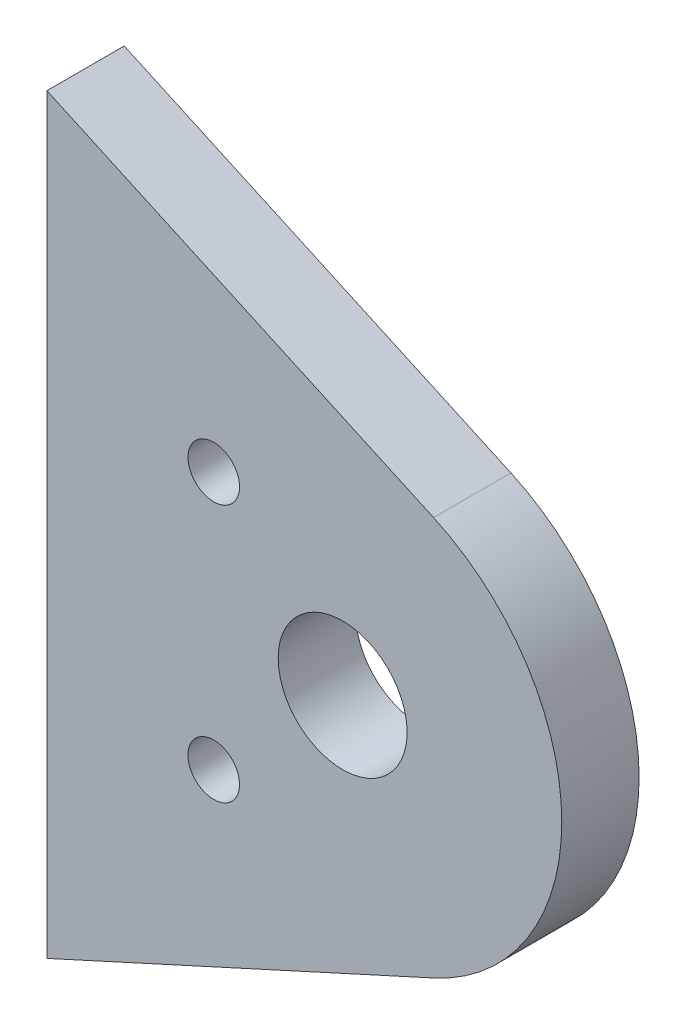
ISO-10303-21;
HEADER;
FILE_DESCRIPTION(('STEP AP214'),'2;1');
FILE_NAME('part.step','',(''),(''),'','','');
FILE_SCHEMA(('AUTOMOTIVE_DESIGN { 1 0 10303 214 1 1 1 1 }'));
ENDSEC;
DATA;
#1=APPLICATION_CONTEXT('core data for automotive mechanical design processes');
#2=APPLICATION_PROTOCOL_DEFINITION('international standard','automotive_design',2000,#1);
#3=PRODUCT_CONTEXT('',#1,'mechanical');
#4=PRODUCT('Part','Part','',(#3));
#5=PRODUCT_RELATED_PRODUCT_CATEGORY('part','',(#4));
#6=PRODUCT_DEFINITION_FORMATION('','',#4);
#7=PRODUCT_DEFINITION_CONTEXT('part definition',#1,'design');
#8=PRODUCT_DEFINITION('design','',#6,#7);
#9=PRODUCT_DEFINITION_SHAPE('','',#8);
#10=(LENGTH_UNIT() NAMED_UNIT(*) SI_UNIT(.MILLI.,.METRE.));
#11=(NAMED_UNIT(*) PLANE_ANGLE_UNIT() SI_UNIT($,.RADIAN.));
#12=(NAMED_UNIT(*) SI_UNIT($,.STERADIAN.) SOLID_ANGLE_UNIT());
#13=UNCERTAINTY_MEASURE_WITH_UNIT(LENGTH_MEASURE(1.E-05),#10,'distance_accuracy_value','');
#14=(GEOMETRIC_REPRESENTATION_CONTEXT(3) GLOBAL_UNCERTAINTY_ASSIGNED_CONTEXT((#13)) GLOBAL_UNIT_ASSIGNED_CONTEXT((#10,
#11,#12)) REPRESENTATION_CONTEXT('',''));
#15=CARTESIAN_POINT('',(0.,0.,0.));
#16=DIRECTION('',(0.,0.,1.));
#17=DIRECTION('',(1.,0.,0.));
#18=AXIS2_PLACEMENT_3D('',#15,#16,#17);
#19=CARTESIAN_POINT('',(50.,0.,42.));
#20=DIRECTION('',(0.,0.,-1.));
#21=DIRECTION('',(-1.,0.,0.));
#22=AXIS2_PLACEMENT_3D('',#19,#20,#21);
#23=CYLINDRICAL_SURFACE('',#22,8.5);
#24=DIRECTION('',(0.,0.,-1.));
#25=VECTOR('',#24,1.);
#26=CARTESIAN_POINT('',(53.5275,-7.73348199390158,42.));
#27=LINE('',#26,#25);
#28=CARTESIAN_POINT('',(53.5275,-7.73348199390158,9.));
#29=VERTEX_POINT('',#28);
#30=CARTESIAN_POINT('',(53.5275,-7.73348199390158,6.00000000000003));
#31=VERTEX_POINT('',#30);
#32=EDGE_CURVE('E91',#29,#31,#27,.T.);
#33=ORIENTED_EDGE('',*,*,#32,.T.);
#34=CARTESIAN_POINT('',(50.,0.,6.00000000000003));
#35=DIRECTION('',(0.,0.,1.));
#36=DIRECTION('',(1.,0.,0.));
#37=AXIS2_PLACEMENT_3D('',#34,#35,#36);
#38=CIRCLE('',#37,8.5);
#39=CARTESIAN_POINT('',(53.5275,7.73348199390159,6.00000000000003));
#40=VERTEX_POINT('',#39);
#41=EDGE_CURVE('E87',#31,#40,#38,.T.);
#42=ORIENTED_EDGE('',*,*,#41,.T.);
#43=DIRECTION('',(0.,0.,-1.));
#44=VECTOR('',#43,1.);
#45=CARTESIAN_POINT('',(53.5275,7.73348199390159,42.));
#46=LINE('',#45,#44);
#47=CARTESIAN_POINT('',(53.5275,7.73348199390159,9.));
#48=VERTEX_POINT('',#47);
#49=EDGE_CURVE('E40',#48,#40,#46,.T.);
#50=ORIENTED_EDGE('',*,*,#49,.F.);
#51=CARTESIAN_POINT('',(50.,0.,9.));
#52=DIRECTION('',(0.,0.,-1.));
#53=DIRECTION('',(-1.,0.,0.));
#54=AXIS2_PLACEMENT_3D('',#51,#52,#53);
#55=CIRCLE('',#54,8.5);
#56=EDGE_CURVE('E99',#48,#29,#55,.T.);
#57=ORIENTED_EDGE('',*,*,#56,.T.);
#58=EDGE_LOOP('',(#33,#42,#50,#57));
#59=FACE_BOUND('',#58,.T.);
#60=ADVANCED_FACE('F32',(#59),#23,.T.);
#61=CARTESIAN_POINT('',(12.13875,26.6122762731319,42.));
#62=DIRECTION('',(-0.415,-0.909821411047245,0.));
#63=DIRECTION('',(0.909821411047245,-0.415,0.));
#64=AXIS2_PLACEMENT_3D('',#61,#62,#63);
#65=PLANE('',#64);
#66=ORIENTED_EDGE('',*,*,#49,.T.);
#67=DIRECTION('',(-0.909821411047245,0.415,0.));
#68=VECTOR('',#67,1.);
#69=CARTESIAN_POINT('',(12.13875,26.6122762731319,6.00000000000003));
#70=LINE('',#69,#68);
#71=CARTESIAN_POINT('',(38.5275,14.5754840883948,6.00000000000003));
#72=VERTEX_POINT('',#71);
#73=EDGE_CURVE('E73',#40,#72,#70,.T.);
#74=ORIENTED_EDGE('',*,*,#73,.T.);
#75=DIRECTION('',(0.,0.,1.));
#76=VECTOR('',#75,1.);
#77=CARTESIAN_POINT('',(38.5275,14.5754840883948,42.));
#78=LINE('',#77,#76);
#79=CARTESIAN_POINT('',(38.5275,14.5754840883948,9.));
#80=VERTEX_POINT('',#79);
#81=EDGE_CURVE('E78',#72,#80,#78,.T.);
#82=ORIENTED_EDGE('',*,*,#81,.T.);
#83=DIRECTION('',(0.909821411047245,-0.415,0.));
#84=VECTOR('',#83,1.);
#85=CARTESIAN_POINT('',(12.13875,26.6122762731319,9.));
#86=LINE('',#85,#84);
#87=EDGE_CURVE('E47',#80,#48,#86,.T.);
#88=ORIENTED_EDGE('',*,*,#87,.T.);
#89=EDGE_LOOP('',(#66,#74,#82,#88));
#90=FACE_BOUND('',#89,.T.);
#91=ADVANCED_FACE('F84',(#90),#65,.F.);
#92=CARTESIAN_POINT('',(12.13875,-26.6122762731319,42.));
#93=DIRECTION('',(-0.415,0.909821411047245,0.));
#94=DIRECTION('',(-0.909821411047245,-0.415,0.));
#95=AXIS2_PLACEMENT_3D('',#92,#93,#94);
#96=PLANE('',#95);
#97=DIRECTION('',(0.,0.,-1.));
#98=VECTOR('',#97,1.);
#99=CARTESIAN_POINT('',(38.5275,-14.5754840883948,42.));
#100=LINE('',#99,#98);
#101=CARTESIAN_POINT('',(38.5275,-14.5754840883948,9.));
#102=VERTEX_POINT('',#101);
#103=CARTESIAN_POINT('',(38.5275,-14.5754840883948,5.99999999999999));
#104=VERTEX_POINT('',#103);
#105=EDGE_CURVE('E11',#102,#104,#100,.T.);
#106=ORIENTED_EDGE('',*,*,#105,.T.);
#107=DIRECTION('',(0.909821411047245,0.415,0.));
#108=VECTOR('',#107,1.);
#109=CARTESIAN_POINT('',(12.13875,-26.6122762731319,6.00000000000003));
#110=LINE('',#109,#108);
#111=EDGE_CURVE('E55',#104,#31,#110,.T.);
#112=ORIENTED_EDGE('',*,*,#111,.T.);
#113=ORIENTED_EDGE('',*,*,#32,.F.);
#114=DIRECTION('',(-0.909821411047245,-0.415,0.));
#115=VECTOR('',#114,1.);
#116=CARTESIAN_POINT('',(12.13875,-26.6122762731319,9.));
#117=LINE('',#116,#115);
#118=EDGE_CURVE('E102',#29,#102,#117,.T.);
#119=ORIENTED_EDGE('',*,*,#118,.T.);
#120=EDGE_LOOP('',(#106,#112,#113,#119));
#121=FACE_BOUND('',#120,.T.);
#122=ADVANCED_FACE('F138',(#121),#96,.F.);
#123=CARTESIAN_POINT('',(50.,0.,42.));
#124=DIRECTION('',(0.,0.,-1.));
#125=DIRECTION('',(-1.,0.,0.));
#126=AXIS2_PLACEMENT_3D('',#123,#124,#125);
#127=CYLINDRICAL_SURFACE('',#126,2.5);
#128=CARTESIAN_POINT('',(50.,0.,6.00000000000003));
#129=DIRECTION('',(0.,0.,1.));
#130=DIRECTION('',(1.,0.,0.));
#131=AXIS2_PLACEMENT_3D('',#128,#129,#130);
#132=CIRCLE('',#131,2.5);
#133=CARTESIAN_POINT('',(47.5,0.,6.00000000000002));
#134=VERTEX_POINT('',#133);
#135=EDGE_CURVE('E86',#134,#134,#132,.T.);
#136=CARTESIAN_POINT('',(50.,0.,9.));
#137=DIRECTION('',(0.,0.,-1.));
#138=DIRECTION('',(-1.,0.,0.));
#139=AXIS2_PLACEMENT_3D('',#136,#137,#138);
#140=CIRCLE('',#139,2.5);
#141=CARTESIAN_POINT('',(47.5,0.,9.00000000000001));
#142=VERTEX_POINT('',#141);
#143=EDGE_CURVE('E79',#142,#142,#140,.T.);
#144=CARTESIAN_POINT('',(47.5,0.,6.00000000000002));
#145=CARTESIAN_POINT('',(47.5,0.,6.03125000000002));
#146=CARTESIAN_POINT('',(47.5,0.,6.06250000000002));
#147=CARTESIAN_POINT('',(47.5,0.,6.12500000000002));
#148=CARTESIAN_POINT('',(47.5,0.,6.15625000000002));
#149=CARTESIAN_POINT('',(47.5,0.,6.21875000000002));
#150=CARTESIAN_POINT('',(47.5,0.,6.25000000000002));
#151=CARTESIAN_POINT('',(47.5,0.,6.31250000000002));
#152=CARTESIAN_POINT('',(47.5,0.,6.34375000000002));
#153=CARTESIAN_POINT('',(47.5,0.,6.40625000000002));
#154=CARTESIAN_POINT('',(47.5,0.,6.43750000000002));
#155=CARTESIAN_POINT('',(47.5,0.,6.50000000000002));
#156=CARTESIAN_POINT('',(47.5,0.,6.53125000000002));
#157=CARTESIAN_POINT('',(47.5,0.,6.59375000000002));
#158=CARTESIAN_POINT('',(47.5,0.,6.62500000000002));
#159=CARTESIAN_POINT('',(47.5,0.,6.68750000000002));
#160=CARTESIAN_POINT('',(47.5,0.,6.71875000000002));
#161=CARTESIAN_POINT('',(47.5,0.,6.78125000000002));
#162=CARTESIAN_POINT('',(47.5,0.,6.81250000000002));
#163=CARTESIAN_POINT('',(47.5,0.,6.87500000000002));
#164=CARTESIAN_POINT('',(47.5,0.,6.90625000000001));
#165=CARTESIAN_POINT('',(47.5,0.,6.96875000000001));
#166=CARTESIAN_POINT('',(47.5,0.,7.00000000000002));
#167=CARTESIAN_POINT('',(47.5,0.,7.06250000000002));
#168=CARTESIAN_POINT('',(47.5,0.,7.09375000000001));
#169=CARTESIAN_POINT('',(47.5,0.,7.15625000000001));
#170=CARTESIAN_POINT('',(47.5,0.,7.18750000000002));
#171=CARTESIAN_POINT('',(47.5,0.,7.25000000000002));
#172=CARTESIAN_POINT('',(47.5,0.,7.28125000000001));
#173=CARTESIAN_POINT('',(47.5,0.,7.34375000000001));
#174=CARTESIAN_POINT('',(47.5,0.,7.37500000000002));
#175=CARTESIAN_POINT('',(47.5,0.,7.43750000000002));
#176=CARTESIAN_POINT('',(47.5,0.,7.46875000000001));
#177=CARTESIAN_POINT('',(47.5,0.,7.53125000000001));
#178=CARTESIAN_POINT('',(47.5,0.,7.56250000000001));
#179=CARTESIAN_POINT('',(47.5,0.,7.62500000000001));
#180=CARTESIAN_POINT('',(47.5,0.,7.65625000000001));
#181=CARTESIAN_POINT('',(47.5,0.,7.71875000000001));
#182=CARTESIAN_POINT('',(47.5,0.,7.75000000000001));
#183=CARTESIAN_POINT('',(47.5,0.,7.81250000000001));
#184=CARTESIAN_POINT('',(47.5,0.,7.84375000000001));
#185=CARTESIAN_POINT('',(47.5,0.,7.90625000000001));
#186=CARTESIAN_POINT('',(47.5,0.,7.93750000000001));
#187=CARTESIAN_POINT('',(47.5,0.,8.00000000000001));
#188=CARTESIAN_POINT('',(47.5,0.,8.03125000000001));
#189=CARTESIAN_POINT('',(47.5,0.,8.09375000000001));
#190=CARTESIAN_POINT('',(47.5,0.,8.12500000000001));
#191=CARTESIAN_POINT('',(47.5,0.,8.18750000000001));
#192=CARTESIAN_POINT('',(47.5,0.,8.21875000000001));
#193=CARTESIAN_POINT('',(47.5,0.,8.28125000000001));
#194=CARTESIAN_POINT('',(47.5,0.,8.31250000000001));
#195=CARTESIAN_POINT('',(47.5,0.,8.37500000000001));
#196=CARTESIAN_POINT('',(47.5,0.,8.40625000000001));
#197=CARTESIAN_POINT('',(47.5,0.,8.46875000000001));
#198=CARTESIAN_POINT('',(47.5,0.,8.50000000000001));
#199=CARTESIAN_POINT('',(47.5,0.,8.56250000000001));
#200=CARTESIAN_POINT('',(47.5,0.,8.59375000000001));
#201=CARTESIAN_POINT('',(47.5,0.,8.65625000000001));
#202=CARTESIAN_POINT('',(47.5,0.,8.68750000000001));
#203=CARTESIAN_POINT('',(47.5,0.,8.75000000000001));
#204=CARTESIAN_POINT('',(47.5,0.,8.78125000000001));
#205=CARTESIAN_POINT('',(47.5,0.,8.84375000000001));
#206=CARTESIAN_POINT('',(47.5,0.,8.87500000000001));
#207=CARTESIAN_POINT('',(47.5,0.,8.93750000000001));
#208=CARTESIAN_POINT('',(47.5,0.,8.96875000000001));
#209=CARTESIAN_POINT('',(47.5,0.,9.00000000000001));
#210=B_SPLINE_CURVE_WITH_KNOTS('',3,(#144,#145,#146,#147,#148,#149,#150,#151,#152,#153,#154,
#155,#156,#157,#158,#159,#160,#161,#162,#163,#164,#165,#166,#167,#168,#169,#170,#171,#172,#173,
#174,#175,#176,#177,#178,#179,#180,#181,#182,#183,#184,#185,#186,#187,#188,#189,#190,#191,#192,
#193,#194,#195,#196,#197,#198,#199,#200,#201,#202,#203,#204,#205,#206,#207,#208,#209),
.UNSPECIFIED.,.F.,.F.,(4,2,2,2,2,2,2,2,2,2,2,2,2,2,2,2,2,2,2,2,2,2,2,2,2,2,2,2,2,2,2,2,4),(0.,
0.0937499999999966,0.1875,0.281249999999997,0.375,0.468749999999997,0.5625,0.656249999999997,
0.750000000000001,0.843749999999997,0.937499999999994,1.03125,1.12499999999999,1.21875,
1.31249999999999,1.40625,1.49999999999999,1.59374999999999,1.68749999999999,1.78124999999999,
1.87499999999999,1.96874999999999,2.06249999999999,2.15624999999999,2.24999999999999,
2.34374999999999,2.43749999999999,2.53124999999999,2.62499999999999,2.71874999999999,
2.81249999999999,2.90624999999999,2.99999999999999),.UNSPECIFIED.);
#211=EDGE_CURVE('BSEAM143',#134,#142,#210,.T.);
#212=ORIENTED_EDGE('',*,*,#135,.F.);
#213=ORIENTED_EDGE('',*,*,#143,.F.);
#214=ORIENTED_EDGE('',*,*,#211,.T.);
#215=ORIENTED_EDGE('',*,*,#211,.F.);
#216=EDGE_LOOP('',(#212,#214,#213,#215));
#217=FACE_BOUND('',#216,.T.);
#218=ADVANCED_FACE('F143',(#217),#127,.F.);
#219=CARTESIAN_POINT('',(38.5275,-29.25,36.));
#220=DIRECTION('',(1.,0.,0.));
#221=DIRECTION('',(0.,0.,-1.));
#222=AXIS2_PLACEMENT_3D('',#219,#220,#221);
#223=PLANE('',#222);
#224=ORIENTED_EDGE('',*,*,#105,.F.);
#225=DIRECTION('',(0.,1.,0.));
#226=VECTOR('',#225,1.);
#227=CARTESIAN_POINT('',(38.5275,-29.25,9.));
#228=LINE('',#227,#226);
#229=EDGE_CURVE('E90',#102,#80,#228,.T.);
#230=ORIENTED_EDGE('',*,*,#229,.T.);
#231=ORIENTED_EDGE('',*,*,#81,.F.);
#232=DIRECTION('',(0.,1.,0.));
#233=VECTOR('',#232,1.);
#234=CARTESIAN_POINT('',(38.5275,-29.25,5.99999999999999));
#235=LINE('',#234,#233);
#236=EDGE_CURVE('E70',#104,#72,#235,.T.);
#237=ORIENTED_EDGE('',*,*,#236,.F.);
#238=EDGE_LOOP('',(#224,#230,#231,#237));
#239=FACE_BOUND('',#238,.T.);
#240=ADVANCED_FACE('F89',(#239),#223,.F.);
#241=CARTESIAN_POINT('',(45.,5.,0.));
#242=DIRECTION('',(0.,0.,1.));
#243=DIRECTION('',(1.,0.,0.));
#244=AXIS2_PLACEMENT_3D('',#241,#242,#243);
#245=CYLINDRICAL_SURFACE('',#244,0.999999999999998);
#246=CARTESIAN_POINT('',(45.,5.,6.00000000000003));
#247=DIRECTION('',(0.,0.,1.));
#248=DIRECTION('',(1.,0.,0.));
#249=AXIS2_PLACEMENT_3D('',#246,#247,#248);
#250=CIRCLE('',#249,0.999999999999998);
#251=CARTESIAN_POINT('',(46.,5.,6.00000000000002));
#252=VERTEX_POINT('',#251);
#253=EDGE_CURVE('E113',#252,#252,#250,.F.);
#254=CARTESIAN_POINT('',(45.,5.,9.));
#255=DIRECTION('',(0.,0.,-1.));
#256=DIRECTION('',(-1.,0.,0.));
#257=AXIS2_PLACEMENT_3D('',#254,#255,#256);
#258=CIRCLE('',#257,0.999999999999998);
#259=CARTESIAN_POINT('',(46.,5.,9.));
#260=VERTEX_POINT('',#259);
#261=EDGE_CURVE('E106',#260,#260,#258,.F.);
#262=CARTESIAN_POINT('',(46.,5.,6.00000000000002));
#263=CARTESIAN_POINT('',(46.,5.,6.03125000000002));
#264=CARTESIAN_POINT('',(46.,5.,6.06250000000002));
#265=CARTESIAN_POINT('',(46.,5.,6.12500000000002));
#266=CARTESIAN_POINT('',(46.,5.,6.15625000000002));
#267=CARTESIAN_POINT('',(46.,5.,6.21875000000002));
#268=CARTESIAN_POINT('',(46.,5.,6.25000000000002));
#269=CARTESIAN_POINT('',(46.,5.,6.31250000000002));
#270=CARTESIAN_POINT('',(46.,5.,6.34375000000002));
#271=CARTESIAN_POINT('',(46.,5.,6.40625000000002));
#272=CARTESIAN_POINT('',(46.,5.,6.43750000000002));
#273=CARTESIAN_POINT('',(46.,5.,6.50000000000002));
#274=CARTESIAN_POINT('',(46.,5.,6.53125000000002));
#275=CARTESIAN_POINT('',(46.,5.,6.59375000000002));
#276=CARTESIAN_POINT('',(46.,5.,6.62500000000002));
#277=CARTESIAN_POINT('',(46.,5.,6.68750000000002));
#278=CARTESIAN_POINT('',(46.,5.,6.71875000000002));
#279=CARTESIAN_POINT('',(46.,5.,6.78125000000002));
#280=CARTESIAN_POINT('',(46.,5.,6.81250000000002));
#281=CARTESIAN_POINT('',(46.,5.,6.87500000000002));
#282=CARTESIAN_POINT('',(46.,5.,6.90625000000002));
#283=CARTESIAN_POINT('',(46.,5.,6.96875000000002));
#284=CARTESIAN_POINT('',(46.,5.,7.00000000000002));
#285=CARTESIAN_POINT('',(46.,5.,7.06250000000002));
#286=CARTESIAN_POINT('',(46.,5.,7.09375000000002));
#287=CARTESIAN_POINT('',(46.,5.,7.15625000000002));
#288=CARTESIAN_POINT('',(46.,5.,7.18750000000002));
#289=CARTESIAN_POINT('',(46.,5.,7.25000000000002));
#290=CARTESIAN_POINT('',(46.,5.,7.28125000000002));
#291=CARTESIAN_POINT('',(46.,5.,7.34375000000002));
#292=CARTESIAN_POINT('',(46.,5.,7.37500000000002));
#293=CARTESIAN_POINT('',(46.,5.,7.43750000000002));
#294=CARTESIAN_POINT('',(46.,5.,7.46875000000001));
#295=CARTESIAN_POINT('',(46.,5.,7.53125000000001));
#296=CARTESIAN_POINT('',(46.,5.,7.56250000000001));
#297=CARTESIAN_POINT('',(46.,5.,7.62500000000001));
#298=CARTESIAN_POINT('',(46.,5.,7.65625000000001));
#299=CARTESIAN_POINT('',(46.,5.,7.71875000000001));
#300=CARTESIAN_POINT('',(46.,5.,7.75000000000001));
#301=CARTESIAN_POINT('',(46.,5.,7.81250000000001));
#302=CARTESIAN_POINT('',(46.,5.,7.84375000000001));
#303=CARTESIAN_POINT('',(46.,5.,7.90625000000001));
#304=CARTESIAN_POINT('',(46.,5.,7.93750000000001));
#305=CARTESIAN_POINT('',(46.,5.,8.00000000000001));
#306=CARTESIAN_POINT('',(46.,5.,8.03125000000001));
#307=CARTESIAN_POINT('',(46.,5.,8.09375000000001));
#308=CARTESIAN_POINT('',(46.,5.,8.12500000000001));
#309=CARTESIAN_POINT('',(46.,5.,8.18750000000001));
#310=CARTESIAN_POINT('',(46.,5.,8.21875000000001));
#311=CARTESIAN_POINT('',(46.,5.,8.28125000000001));
#312=CARTESIAN_POINT('',(46.,5.,8.31250000000001));
#313=CARTESIAN_POINT('',(46.,5.,8.37500000000001));
#314=CARTESIAN_POINT('',(46.,5.,8.40625000000001));
#315=CARTESIAN_POINT('',(46.,5.,8.46875000000001));
#316=CARTESIAN_POINT('',(46.,5.,8.50000000000001));
#317=CARTESIAN_POINT('',(46.,5.,8.56250000000001));
#318=CARTESIAN_POINT('',(46.,5.,8.59375000000001));
#319=CARTESIAN_POINT('',(46.,5.,8.65625000000001));
#320=CARTESIAN_POINT('',(46.,5.,8.6875));
#321=CARTESIAN_POINT('',(46.,5.,8.75));
#322=CARTESIAN_POINT('',(46.,5.,8.78125));
#323=CARTESIAN_POINT('',(46.,5.,8.84375));
#324=CARTESIAN_POINT('',(46.,5.,8.875));
#325=CARTESIAN_POINT('',(46.,5.,8.9375));
#326=CARTESIAN_POINT('',(46.,5.,8.96875));
#327=CARTESIAN_POINT('',(46.,5.,9.));
#328=B_SPLINE_CURVE_WITH_KNOTS('',3,(#262,#263,#264,#265,#266,#267,#268,#269,#270,#271,#272,
#273,#274,#275,#276,#277,#278,#279,#280,#281,#282,#283,#284,#285,#286,#287,#288,#289,#290,#291,
#292,#293,#294,#295,#296,#297,#298,#299,#300,#301,#302,#303,#304,#305,#306,#307,#308,#309,#310,
#311,#312,#313,#314,#315,#316,#317,#318,#319,#320,#321,#322,#323,#324,#325,#326,#327),
.UNSPECIFIED.,.F.,.F.,(4,2,2,2,2,2,2,2,2,2,2,2,2,2,2,2,2,2,2,2,2,2,2,2,2,2,2,2,2,2,2,2,4),(0.,
0.0937499999999992,0.187499999999998,0.281249999999998,0.374999999999997,0.468749999999997,
0.562499999999996,0.656249999999995,0.749999999999995,0.843749999999994,0.937499999999993,
1.03124999999999,1.12499999999999,1.21874999999999,1.31249999999999,1.40624999999999,
1.49999999999999,1.59374999999999,1.68749999999999,1.78124999999999,1.87499999999999,
1.96874999999999,2.06249999999998,2.15624999999998,2.24999999999998,2.34374999999998,
2.43749999999998,2.53124999999998,2.62499999999998,2.71874999999998,2.81249999999998,
2.90624999999998,2.99999999999998),.UNSPECIFIED.);
#329=EDGE_CURVE('BSEAM153',#252,#260,#328,.T.);
#330=ORIENTED_EDGE('',*,*,#253,.T.);
#331=ORIENTED_EDGE('',*,*,#261,.T.);
#332=ORIENTED_EDGE('',*,*,#329,.T.);
#333=ORIENTED_EDGE('',*,*,#329,.F.);
#334=EDGE_LOOP('',(#330,#332,#331,#333));
#335=FACE_BOUND('',#334,.T.);
#336=ADVANCED_FACE('F153',(#335),#245,.F.);
#337=CARTESIAN_POINT('',(45.,-5.,0.));
#338=DIRECTION('',(0.,0.,1.));
#339=DIRECTION('',(1.,0.,0.));
#340=AXIS2_PLACEMENT_3D('',#337,#338,#339);
#341=CYLINDRICAL_SURFACE('',#340,0.999999999999998);
#342=CARTESIAN_POINT('',(45.,-5.,6.00000000000003));
#343=DIRECTION('',(0.,0.,1.));
#344=DIRECTION('',(1.,0.,0.));
#345=AXIS2_PLACEMENT_3D('',#342,#343,#344);
#346=CIRCLE('',#345,0.999999999999998);
#347=CARTESIAN_POINT('',(46.,-5.,6.00000000000002));
#348=VERTEX_POINT('',#347);
#349=EDGE_CURVE('E116',#348,#348,#346,.F.);
#350=CARTESIAN_POINT('',(45.,-5.,9.));
#351=DIRECTION('',(0.,0.,-1.));
#352=DIRECTION('',(-1.,0.,0.));
#353=AXIS2_PLACEMENT_3D('',#350,#351,#352);
#354=CIRCLE('',#353,0.999999999999998);
#355=CARTESIAN_POINT('',(46.,-5.,9.));
#356=VERTEX_POINT('',#355);
#357=EDGE_CURVE('E35',#356,#356,#354,.F.);
#358=CARTESIAN_POINT('',(46.,-5.,6.00000000000002));
#359=CARTESIAN_POINT('',(46.,-5.,6.03125000000002));
#360=CARTESIAN_POINT('',(46.,-5.,6.06250000000002));
#361=CARTESIAN_POINT('',(46.,-5.,6.12500000000002));
#362=CARTESIAN_POINT('',(46.,-5.,6.15625000000002));
#363=CARTESIAN_POINT('',(46.,-5.,6.21875000000002));
#364=CARTESIAN_POINT('',(46.,-5.,6.25000000000002));
#365=CARTESIAN_POINT('',(46.,-5.,6.31250000000002));
#366=CARTESIAN_POINT('',(46.,-5.,6.34375000000002));
#367=CARTESIAN_POINT('',(46.,-5.,6.40625000000002));
#368=CARTESIAN_POINT('',(46.,-5.,6.43750000000002));
#369=CARTESIAN_POINT('',(46.,-5.,6.50000000000002));
#370=CARTESIAN_POINT('',(46.,-5.,6.53125000000002));
#371=CARTESIAN_POINT('',(46.,-5.,6.59375000000002));
#372=CARTESIAN_POINT('',(46.,-5.,6.62500000000002));
#373=CARTESIAN_POINT('',(46.,-5.,6.68750000000002));
#374=CARTESIAN_POINT('',(46.,-5.,6.71875000000002));
#375=CARTESIAN_POINT('',(46.,-5.,6.78125000000002));
#376=CARTESIAN_POINT('',(46.,-5.,6.81250000000002));
#377=CARTESIAN_POINT('',(46.,-5.,6.87500000000002));
#378=CARTESIAN_POINT('',(46.,-5.,6.90625000000002));
#379=CARTESIAN_POINT('',(46.,-5.,6.96875000000002));
#380=CARTESIAN_POINT('',(46.,-5.,7.00000000000002));
#381=CARTESIAN_POINT('',(46.,-5.,7.06250000000002));
#382=CARTESIAN_POINT('',(46.,-5.,7.09375000000002));
#383=CARTESIAN_POINT('',(46.,-5.,7.15625000000002));
#384=CARTESIAN_POINT('',(46.,-5.,7.18750000000002));
#385=CARTESIAN_POINT('',(46.,-5.,7.25000000000002));
#386=CARTESIAN_POINT('',(46.,-5.,7.28125000000002));
#387=CARTESIAN_POINT('',(46.,-5.,7.34375000000002));
#388=CARTESIAN_POINT('',(46.,-5.,7.37500000000002));
#389=CARTESIAN_POINT('',(46.,-5.,7.43750000000002));
#390=CARTESIAN_POINT('',(46.,-5.,7.46875000000001));
#391=CARTESIAN_POINT('',(46.,-5.,7.53125000000001));
#392=CARTESIAN_POINT('',(46.,-5.,7.56250000000001));
#393=CARTESIAN_POINT('',(46.,-5.,7.62500000000001));
#394=CARTESIAN_POINT('',(46.,-5.,7.65625000000001));
#395=CARTESIAN_POINT('',(46.,-5.,7.71875000000001));
#396=CARTESIAN_POINT('',(46.,-5.,7.75000000000001));
#397=CARTESIAN_POINT('',(46.,-5.,7.81250000000001));
#398=CARTESIAN_POINT('',(46.,-5.,7.84375000000001));
#399=CARTESIAN_POINT('',(46.,-5.,7.90625000000001));
#400=CARTESIAN_POINT('',(46.,-5.,7.93750000000001));
#401=CARTESIAN_POINT('',(46.,-5.,8.00000000000001));
#402=CARTESIAN_POINT('',(46.,-5.,8.03125000000001));
#403=CARTESIAN_POINT('',(46.,-5.,8.09375000000001));
#404=CARTESIAN_POINT('',(46.,-5.,8.12500000000001));
#405=CARTESIAN_POINT('',(46.,-5.,8.18750000000001));
#406=CARTESIAN_POINT('',(46.,-5.,8.21875000000001));
#407=CARTESIAN_POINT('',(46.,-5.,8.28125000000001));
#408=CARTESIAN_POINT('',(46.,-5.,8.31250000000001));
#409=CARTESIAN_POINT('',(46.,-5.,8.37500000000001));
#410=CARTESIAN_POINT('',(46.,-5.,8.40625000000001));
#411=CARTESIAN_POINT('',(46.,-5.,8.46875000000001));
#412=CARTESIAN_POINT('',(46.,-5.,8.50000000000001));
#413=CARTESIAN_POINT('',(46.,-5.,8.56250000000001));
#414=CARTESIAN_POINT('',(46.,-5.,8.59375000000001));
#415=CARTESIAN_POINT('',(46.,-5.,8.65625000000001));
#416=CARTESIAN_POINT('',(46.,-5.,8.6875));
#417=CARTESIAN_POINT('',(46.,-5.,8.75));
#418=CARTESIAN_POINT('',(46.,-5.,8.78125));
#419=CARTESIAN_POINT('',(46.,-5.,8.84375));
#420=CARTESIAN_POINT('',(46.,-5.,8.875));
#421=CARTESIAN_POINT('',(46.,-5.,8.9375));
#422=CARTESIAN_POINT('',(46.,-5.,8.96875));
#423=CARTESIAN_POINT('',(46.,-5.,9.));
#424=B_SPLINE_CURVE_WITH_KNOTS('',3,(#358,#359,#360,#361,#362,#363,#364,#365,#366,#367,#368,
#369,#370,#371,#372,#373,#374,#375,#376,#377,#378,#379,#380,#381,#382,#383,#384,#385,#386,#387,
#388,#389,#390,#391,#392,#393,#394,#395,#396,#397,#398,#399,#400,#401,#402,#403,#404,#405,#406,
#407,#408,#409,#410,#411,#412,#413,#414,#415,#416,#417,#418,#419,#420,#421,#422,#423),
.UNSPECIFIED.,.F.,.F.,(4,2,2,2,2,2,2,2,2,2,2,2,2,2,2,2,2,2,2,2,2,2,2,2,2,2,2,2,2,2,2,2,4),(0.,
0.0937499999999992,0.187499999999998,0.281249999999998,0.374999999999997,0.468749999999997,
0.562499999999996,0.656249999999995,0.749999999999995,0.843749999999994,0.937499999999993,
1.03124999999999,1.12499999999999,1.21874999999999,1.31249999999999,1.40624999999999,
1.49999999999999,1.59374999999999,1.68749999999999,1.78124999999999,1.87499999999999,
1.96874999999999,2.06249999999998,2.15624999999998,2.24999999999998,2.34374999999998,
2.43749999999998,2.53124999999998,2.62499999999998,2.71874999999998,2.81249999999998,
2.90624999999998,2.99999999999998),.UNSPECIFIED.);
#425=EDGE_CURVE('BSEAM120',#348,#356,#424,.T.);
#426=ORIENTED_EDGE('',*,*,#349,.T.);
#427=ORIENTED_EDGE('',*,*,#357,.T.);
#428=ORIENTED_EDGE('',*,*,#425,.T.);
#429=ORIENTED_EDGE('',*,*,#425,.F.);
#430=EDGE_LOOP('',(#426,#428,#427,#429));
#431=FACE_BOUND('',#430,.T.);
#432=ADVANCED_FACE('F120',(#431),#341,.F.);
#433=CARTESIAN_POINT('',(-29.25,-29.25,9.));
#434=DIRECTION('',(0.,0.,-1.));
#435=DIRECTION('',(-1.,0.,0.));
#436=AXIS2_PLACEMENT_3D('',#433,#434,#435);
#437=PLANE('',#436);
#438=ORIENTED_EDGE('',*,*,#143,.T.);
#439=EDGE_LOOP('',(#438));
#440=FACE_BOUND('',#439,.T.);
#441=ORIENTED_EDGE('',*,*,#261,.F.);
#442=EDGE_LOOP('',(#441));
#443=FACE_BOUND('',#442,.T.);
#444=ORIENTED_EDGE('',*,*,#357,.F.);
#445=EDGE_LOOP('',(#444));
#446=FACE_BOUND('',#445,.T.);
#447=ORIENTED_EDGE('',*,*,#56,.F.);
#448=ORIENTED_EDGE('',*,*,#87,.F.);
#449=ORIENTED_EDGE('',*,*,#229,.F.);
#450=ORIENTED_EDGE('',*,*,#118,.F.);
#451=EDGE_LOOP('',(#447,#448,#449,#450));
#452=FACE_BOUND('',#451,.T.);
#453=ADVANCED_FACE('F124',(#440,#443,#446,#452),#437,.F.);
#454=CARTESIAN_POINT('',(-29.25,-29.25,6.00000000000003));
#455=DIRECTION('',(0.,0.,1.));
#456=DIRECTION('',(1.,0.,0.));
#457=AXIS2_PLACEMENT_3D('',#454,#455,#456);
#458=PLANE('',#457);
#459=ORIENTED_EDGE('',*,*,#135,.T.);
#460=EDGE_LOOP('',(#459));
#461=FACE_BOUND('',#460,.T.);
#462=ORIENTED_EDGE('',*,*,#253,.F.);
#463=EDGE_LOOP('',(#462));
#464=FACE_BOUND('',#463,.T.);
#465=ORIENTED_EDGE('',*,*,#349,.F.);
#466=EDGE_LOOP('',(#465));
#467=FACE_BOUND('',#466,.T.);
#468=ORIENTED_EDGE('',*,*,#41,.F.);
#469=ORIENTED_EDGE('',*,*,#111,.F.);
#470=ORIENTED_EDGE('',*,*,#236,.T.);
#471=ORIENTED_EDGE('',*,*,#73,.F.);
#472=EDGE_LOOP('',(#468,#469,#470,#471));
#473=FACE_BOUND('',#472,.T.);
#474=ADVANCED_FACE('F72',(#461,#464,#467,#473),#458,.F.);
#475=CLOSED_SHELL('',(#60,#91,#122,#218,#240,#336,#432,#453,#474));
#476=MANIFOLD_SOLID_BREP('B2',#475);
#477=ADVANCED_BREP_SHAPE_REPRESENTATION('',(#18,#476),#14);
#478=SHAPE_DEFINITION_REPRESENTATION(#9,#477);
ENDSEC;
END-ISO-10303-21;
